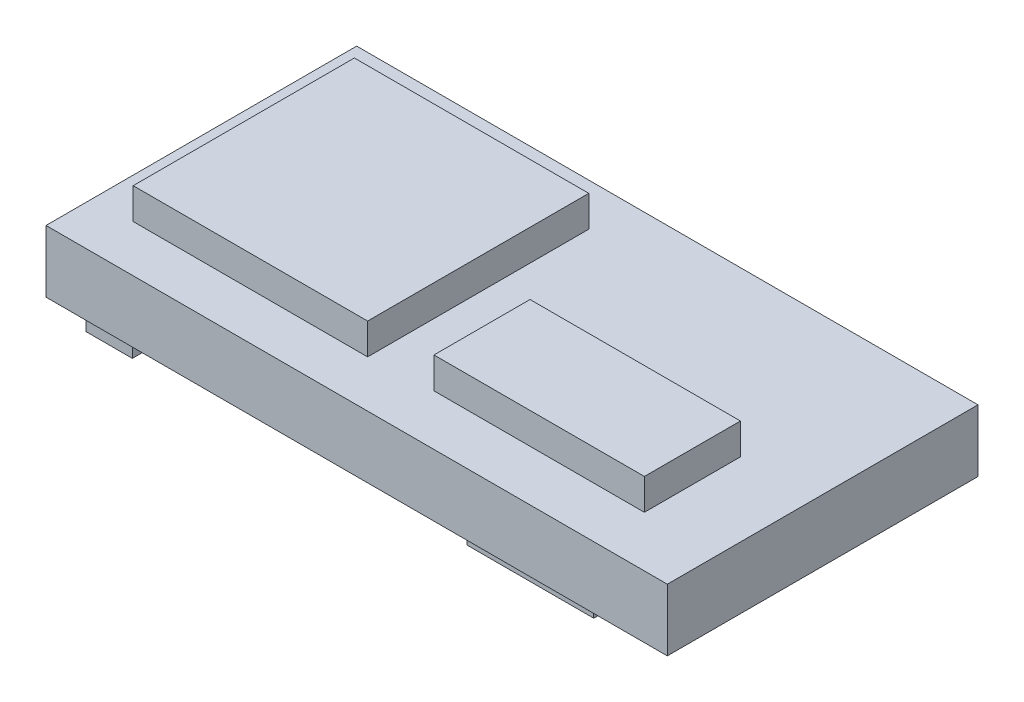
ISO-10303-21;
HEADER;
FILE_DESCRIPTION(('STEP AP214'),'2;1');
FILE_NAME('part.step','',(''),(''),'','','');
FILE_SCHEMA(('AUTOMOTIVE_DESIGN { 1 0 10303 214 1 1 1 1 }'));
ENDSEC;
DATA;
#1=APPLICATION_CONTEXT('core data for automotive mechanical design processes');
#2=APPLICATION_PROTOCOL_DEFINITION('international standard','automotive_design',2000,#1);
#3=PRODUCT_CONTEXT('',#1,'mechanical');
#4=PRODUCT('Part','Part','',(#3));
#5=PRODUCT_RELATED_PRODUCT_CATEGORY('part','',(#4));
#6=PRODUCT_DEFINITION_FORMATION('','',#4);
#7=PRODUCT_DEFINITION_CONTEXT('part definition',#1,'design');
#8=PRODUCT_DEFINITION('design','',#6,#7);
#9=PRODUCT_DEFINITION_SHAPE('','',#8);
#10=(LENGTH_UNIT() NAMED_UNIT(*) SI_UNIT(.MILLI.,.METRE.));
#11=(NAMED_UNIT(*) PLANE_ANGLE_UNIT() SI_UNIT($,.RADIAN.));
#12=(NAMED_UNIT(*) SI_UNIT($,.STERADIAN.) SOLID_ANGLE_UNIT());
#13=UNCERTAINTY_MEASURE_WITH_UNIT(LENGTH_MEASURE(1.E-05),#10,'distance_accuracy_value','');
#14=(GEOMETRIC_REPRESENTATION_CONTEXT(3) GLOBAL_UNCERTAINTY_ASSIGNED_CONTEXT((#13)) GLOBAL_UNIT_ASSIGNED_CONTEXT((#10,
#11,#12)) REPRESENTATION_CONTEXT('',''));
#15=CARTESIAN_POINT('',(0.,0.,0.));
#16=DIRECTION('',(0.,0.,1.));
#17=DIRECTION('',(1.,0.,0.));
#18=AXIS2_PLACEMENT_3D('',#15,#16,#17);
#19=CARTESIAN_POINT('',(0.,0.,0.));
#20=DIRECTION('',(0.,1.,0.));
#21=DIRECTION('',(0.,0.,1.));
#22=AXIS2_PLACEMENT_3D('',#19,#20,#21);
#23=PLANE('',#22);
#24=DIRECTION('',(0.,0.,1.));
#25=VECTOR('',#24,1.);
#26=CARTESIAN_POINT('',(-10.0391604044603,0.,2.86887811132885));
#27=LINE('',#26,#25);
#28=CARTESIAN_POINT('',(-10.0391604044603,0.,2.86887811132885));
#29=VERTEX_POINT('',#28);
#30=CARTESIAN_POINT('',(-10.0391604044603,0.,5.48169122046716));
#31=VERTEX_POINT('',#30);
#32=EDGE_CURVE('E263',#29,#31,#27,.T.);
#33=ORIENTED_EDGE('',*,*,#32,.F.);
#34=DIRECTION('',(1.,0.,0.));
#35=VECTOR('',#34,1.);
#36=CARTESIAN_POINT('',(-10.0391604044603,0.,2.86887811132885));
#37=LINE('',#36,#35);
#38=CARTESIAN_POINT('',(-11.9295872624434,0.,2.86887811132885));
#39=VERTEX_POINT('',#38);
#40=EDGE_CURVE('E276',#39,#29,#37,.T.);
#41=ORIENTED_EDGE('',*,*,#40,.F.);
#42=DIRECTION('',(0.,0.,-1.));
#43=VECTOR('',#42,1.);
#44=CARTESIAN_POINT('',(-11.9295872624434,0.,2.86887811132885));
#45=LINE('',#44,#43);
#46=CARTESIAN_POINT('',(-11.9295872624434,0.,5.48169122046716));
#47=VERTEX_POINT('',#46);
#48=EDGE_CURVE('E285',#47,#39,#45,.T.);
#49=ORIENTED_EDGE('',*,*,#48,.F.);
#50=DIRECTION('',(-1.,0.,0.));
#51=VECTOR('',#50,1.);
#52=CARTESIAN_POINT('',(-10.0391604044603,0.,5.48169122046716));
#53=LINE('',#52,#51);
#54=EDGE_CURVE('E266',#31,#47,#53,.T.);
#55=ORIENTED_EDGE('',*,*,#54,.F.);
#56=EDGE_LOOP('',(#33,#41,#49,#55));
#57=FACE_BOUND('',#56,.T.);
#58=DIRECTION('',(0.,0.,1.));
#59=VECTOR('',#58,1.);
#60=CARTESIAN_POINT('',(-10.0391604044603,0.,-5.21407019473941));
#61=LINE('',#60,#59);
#62=CARTESIAN_POINT('',(-10.0391604044603,0.,-5.21407019473941));
#63=VERTEX_POINT('',#62);
#64=CARTESIAN_POINT('',(-10.0391604044603,0.,-2.2372155645769));
#65=VERTEX_POINT('',#64);
#66=EDGE_CURVE('E334',#63,#65,#61,.T.);
#67=ORIENTED_EDGE('',*,*,#66,.F.);
#68=DIRECTION('',(1.,0.,0.));
#69=VECTOR('',#68,1.);
#70=CARTESIAN_POINT('',(-10.0391604044603,0.,-5.21407019473941));
#71=LINE('',#70,#69);
#72=CARTESIAN_POINT('',(-11.9295872624434,0.,-5.21407019473941));
#73=VERTEX_POINT('',#72);
#74=EDGE_CURVE('E339',#73,#63,#71,.T.);
#75=ORIENTED_EDGE('',*,*,#74,.F.);
#76=DIRECTION('',(0.,0.,-1.));
#77=VECTOR('',#76,1.);
#78=CARTESIAN_POINT('',(-11.9295872624434,0.,-5.21407019473941));
#79=LINE('',#78,#77);
#80=CARTESIAN_POINT('',(-11.9295872624434,0.,-2.2372155645769));
#81=VERTEX_POINT('',#80);
#82=EDGE_CURVE('E351',#81,#73,#79,.T.);
#83=ORIENTED_EDGE('',*,*,#82,.F.);
#84=DIRECTION('',(-1.,0.,0.));
#85=VECTOR('',#84,1.);
#86=CARTESIAN_POINT('',(-10.0391604044603,0.,-2.2372155645769));
#87=LINE('',#86,#85);
#88=EDGE_CURVE('E348',#65,#81,#87,.T.);
#89=ORIENTED_EDGE('',*,*,#88,.F.);
#90=EDGE_LOOP('',(#67,#75,#83,#89));
#91=FACE_BOUND('',#90,.T.);
#92=DIRECTION('',(0.,0.,1.));
#93=VECTOR('',#92,1.);
#94=CARTESIAN_POINT('',(-12.7,0.,6.35));
#95=LINE('',#94,#93);
#96=CARTESIAN_POINT('',(-12.7,0.,-6.35));
#97=VERTEX_POINT('',#96);
#98=CARTESIAN_POINT('',(-12.7,0.,6.35));
#99=VERTEX_POINT('',#98);
#100=EDGE_CURVE('E458',#97,#99,#95,.T.);
#101=ORIENTED_EDGE('',*,*,#100,.F.);
#102=DIRECTION('',(-1.,0.,0.));
#103=VECTOR('',#102,1.);
#104=CARTESIAN_POINT('',(12.7,0.,-6.35));
#105=LINE('',#104,#103);
#106=CARTESIAN_POINT('',(12.7,0.,-6.35));
#107=VERTEX_POINT('',#106);
#108=EDGE_CURVE('E463',#107,#97,#105,.T.);
#109=ORIENTED_EDGE('',*,*,#108,.F.);
#110=DIRECTION('',(0.,0.,-1.));
#111=VECTOR('',#110,1.);
#112=CARTESIAN_POINT('',(12.7,0.,6.35));
#113=LINE('',#112,#111);
#114=CARTESIAN_POINT('',(12.7,0.,6.35));
#115=VERTEX_POINT('',#114);
#116=EDGE_CURVE('E474',#115,#107,#113,.T.);
#117=ORIENTED_EDGE('',*,*,#116,.F.);
#118=DIRECTION('',(1.,0.,0.));
#119=VECTOR('',#118,1.);
#120=CARTESIAN_POINT('',(12.7,0.,6.35));
#121=LINE('',#120,#119);
#122=EDGE_CURVE('E472',#99,#115,#121,.T.);
#123=ORIENTED_EDGE('',*,*,#122,.F.);
#124=EDGE_LOOP('',(#101,#109,#117,#123));
#125=FACE_BOUND('',#124,.T.);
#126=DIRECTION('',(0.,0.,1.));
#127=VECTOR('',#126,1.);
#128=CARTESIAN_POINT('',(1.5898607842928,0.,-2.2372155645769));
#129=LINE('',#128,#127);
#130=CARTESIAN_POINT('',(1.5898607842928,0.,-2.2372155645769));
#131=VERTEX_POINT('',#130);
#132=CARTESIAN_POINT('',(1.5898607842928,0.,3.65678358603816));
#133=VERTEX_POINT('',#132);
#134=EDGE_CURVE('E367',#131,#133,#129,.T.);
#135=ORIENTED_EDGE('',*,*,#134,.F.);
#136=DIRECTION('',(1.,0.,0.));
#137=VECTOR('',#136,1.);
#138=CARTESIAN_POINT('',(1.5898607842928,0.,-2.2372155645769));
#139=LINE('',#138,#137);
#140=CARTESIAN_POINT('',(-3.91703483796846,0.,-2.2372155645769));
#141=VERTEX_POINT('',#140);
#142=EDGE_CURVE('E372',#141,#131,#139,.T.);
#143=ORIENTED_EDGE('',*,*,#142,.F.);
#144=DIRECTION('',(0.,0.,-1.));
#145=VECTOR('',#144,1.);
#146=CARTESIAN_POINT('',(-3.91703483796846,0.,-2.2372155645769));
#147=LINE('',#146,#145);
#148=CARTESIAN_POINT('',(-3.91703483796846,0.,3.65678358603816));
#149=VERTEX_POINT('',#148);
#150=EDGE_CURVE('E384',#149,#141,#147,.T.);
#151=ORIENTED_EDGE('',*,*,#150,.F.);
#152=DIRECTION('',(-1.,0.,0.));
#153=VECTOR('',#152,1.);
#154=CARTESIAN_POINT('',(1.5898607842928,0.,3.65678358603816));
#155=LINE('',#154,#153);
#156=EDGE_CURVE('E381',#133,#149,#155,.T.);
#157=ORIENTED_EDGE('',*,*,#156,.F.);
#158=EDGE_LOOP('',(#135,#143,#151,#157));
#159=FACE_BOUND('',#158,.T.);
#160=DIRECTION('',(0.,0.,1.));
#161=VECTOR('',#160,1.);
#162=CARTESIAN_POINT('',(-10.0391604044603,0.,-1.09416741381096));
#163=LINE('',#162,#161);
#164=CARTESIAN_POINT('',(-10.0391604044603,0.,-1.09416741381096));
#165=VERTEX_POINT('',#164);
#166=CARTESIAN_POINT('',(-10.0391604044603,0.,1.83236020687616));
#167=VERTEX_POINT('',#166);
#168=EDGE_CURVE('E301',#165,#167,#163,.T.);
#169=ORIENTED_EDGE('',*,*,#168,.F.);
#170=DIRECTION('',(1.,0.,0.));
#171=VECTOR('',#170,1.);
#172=CARTESIAN_POINT('',(-10.0391604044603,0.,-1.09416741381096));
#173=LINE('',#172,#171);
#174=CARTESIAN_POINT('',(-11.9295872624434,0.,-1.09416741381096));
#175=VERTEX_POINT('',#174);
#176=EDGE_CURVE('E306',#175,#165,#173,.T.);
#177=ORIENTED_EDGE('',*,*,#176,.F.);
#178=DIRECTION('',(0.,0.,-1.));
#179=VECTOR('',#178,1.);
#180=CARTESIAN_POINT('',(-11.9295872624434,0.,-1.09416741381096));
#181=LINE('',#180,#179);
#182=CARTESIAN_POINT('',(-11.9295872624434,0.,1.83236020687616));
#183=VERTEX_POINT('',#182);
#184=EDGE_CURVE('E318',#183,#175,#181,.T.);
#185=ORIENTED_EDGE('',*,*,#184,.F.);
#186=DIRECTION('',(-1.,0.,0.));
#187=VECTOR('',#186,1.);
#188=CARTESIAN_POINT('',(-10.0391604044603,0.,1.83236020687616));
#189=LINE('',#188,#187);
#190=EDGE_CURVE('E315',#167,#183,#189,.T.);
#191=ORIENTED_EDGE('',*,*,#190,.F.);
#192=EDGE_LOOP('',(#169,#177,#185,#191));
#193=FACE_BOUND('',#192,.T.);
#194=DIRECTION('',(0.,0.,1.));
#195=VECTOR('',#194,1.);
#196=CARTESIAN_POINT('',(8.5913828855837,0.,1.38506022395291));
#197=LINE('',#196,#195);
#198=CARTESIAN_POINT('',(8.5913828855837,0.,1.38506022395291));
#199=VERTEX_POINT('',#198);
#200=CARTESIAN_POINT('',(8.5913828855837,0.,5.25072071499721));
#201=VERTEX_POINT('',#200);
#202=EDGE_CURVE('E262',#199,#201,#197,.T.);
#203=ORIENTED_EDGE('',*,*,#202,.F.);
#204=DIRECTION('',(1.,0.,0.));
#205=VECTOR('',#204,1.);
#206=CARTESIAN_POINT('',(8.5913828855837,0.,1.38506022395291));
#207=LINE('',#206,#205);
#208=CARTESIAN_POINT('',(3.41832114617091,0.,1.38506022395291));
#209=VERTEX_POINT('',#208);
#210=EDGE_CURVE('E259',#209,#199,#207,.T.);
#211=ORIENTED_EDGE('',*,*,#210,.F.);
#212=DIRECTION('',(0.,0.,-1.));
#213=VECTOR('',#212,1.);
#214=CARTESIAN_POINT('',(3.41832114617091,0.,1.38506022395291));
#215=LINE('',#214,#213);
#216=CARTESIAN_POINT('',(3.41832114617091,0.,5.25072071499721));
#217=VERTEX_POINT('',#216);
#218=EDGE_CURVE('E53',#217,#209,#215,.T.);
#219=ORIENTED_EDGE('',*,*,#218,.F.);
#220=DIRECTION('',(-1.,0.,0.));
#221=VECTOR('',#220,1.);
#222=CARTESIAN_POINT('',(8.5913828855837,0.,5.25072071499721));
#223=LINE('',#222,#221);
#224=EDGE_CURVE('E48',#201,#217,#223,.T.);
#225=ORIENTED_EDGE('',*,*,#224,.F.);
#226=EDGE_LOOP('',(#203,#211,#219,#225));
#227=FACE_BOUND('',#226,.T.);
#228=ADVANCED_FACE('F33',(#57,#91,#125,#159,#193,#227),#23,.F.);
#229=CARTESIAN_POINT('',(0.,2.54,0.));
#230=DIRECTION('',(0.,1.,0.));
#231=DIRECTION('',(0.,0.,1.));
#232=AXIS2_PLACEMENT_3D('',#229,#230,#231);
#233=PLANE('',#232);
#234=DIRECTION('',(0.,0.,1.));
#235=VECTOR('',#234,1.);
#236=CARTESIAN_POINT('',(-12.7,2.54,6.35));
#237=LINE('',#236,#235);
#238=CARTESIAN_POINT('',(-12.7,2.54,-6.35));
#239=VERTEX_POINT('',#238);
#240=CARTESIAN_POINT('',(-12.7,2.54,6.35));
#241=VERTEX_POINT('',#240);
#242=EDGE_CURVE('E459',#239,#241,#237,.T.);
#243=ORIENTED_EDGE('',*,*,#242,.T.);
#244=DIRECTION('',(1.,0.,0.));
#245=VECTOR('',#244,1.);
#246=CARTESIAN_POINT('',(12.7,2.54,6.35));
#247=LINE('',#246,#245);
#248=CARTESIAN_POINT('',(12.7,2.54,6.35));
#249=VERTEX_POINT('',#248);
#250=EDGE_CURVE('E462',#241,#249,#247,.T.);
#251=ORIENTED_EDGE('',*,*,#250,.T.);
#252=DIRECTION('',(0.,0.,-1.));
#253=VECTOR('',#252,1.);
#254=CARTESIAN_POINT('',(12.7,2.54,6.35));
#255=LINE('',#254,#253);
#256=CARTESIAN_POINT('',(12.7,2.54,-6.35));
#257=VERTEX_POINT('',#256);
#258=EDGE_CURVE('E465',#249,#257,#255,.T.);
#259=ORIENTED_EDGE('',*,*,#258,.T.);
#260=DIRECTION('',(-1.,0.,0.));
#261=VECTOR('',#260,1.);
#262=CARTESIAN_POINT('',(12.7,2.54,-6.35));
#263=LINE('',#262,#261);
#264=EDGE_CURVE('E467',#257,#239,#263,.T.);
#265=ORIENTED_EDGE('',*,*,#264,.T.);
#266=EDGE_LOOP('',(#243,#251,#259,#265));
#267=FACE_BOUND('',#266,.T.);
#268=DIRECTION('',(1.,0.,0.));
#269=VECTOR('',#268,1.);
#270=CARTESIAN_POINT('',(-11.0562290416038,2.54,4.43024130989497));
#271=LINE('',#270,#269);
#272=CARTESIAN_POINT('',(-11.0562290416038,2.54,4.43024130989497));
#273=VERTEX_POINT('',#272);
#274=CARTESIAN_POINT('',(-1.47244171815752,2.54,4.43024130989497));
#275=VERTEX_POINT('',#274);
#276=EDGE_CURVE('E443',#273,#275,#271,.T.);
#277=ORIENTED_EDGE('',*,*,#276,.F.);
#278=DIRECTION('',(0.,0.,1.));
#279=VECTOR('',#278,1.);
#280=CARTESIAN_POINT('',(-11.0562290416038,2.54,-4.61106748580907));
#281=LINE('',#280,#279);
#282=CARTESIAN_POINT('',(-11.0562290416038,2.54,-4.61106748580907));
#283=VERTEX_POINT('',#282);
#284=EDGE_CURVE('E429',#283,#273,#281,.T.);
#285=ORIENTED_EDGE('',*,*,#284,.F.);
#286=DIRECTION('',(-1.,0.,0.));
#287=VECTOR('',#286,1.);
#288=CARTESIAN_POINT('',(-11.0562290416038,2.54,-4.61106748580907));
#289=LINE('',#288,#287);
#290=CARTESIAN_POINT('',(-1.47244171815752,2.54,-4.61106748580907));
#291=VERTEX_POINT('',#290);
#292=EDGE_CURVE('E434',#291,#283,#289,.T.);
#293=ORIENTED_EDGE('',*,*,#292,.F.);
#294=DIRECTION('',(0.,0.,-1.));
#295=VECTOR('',#294,1.);
#296=CARTESIAN_POINT('',(-1.47244171815752,2.54,-4.61106748580907));
#297=LINE('',#296,#295);
#298=EDGE_CURVE('E445',#275,#291,#297,.T.);
#299=ORIENTED_EDGE('',*,*,#298,.F.);
#300=EDGE_LOOP('',(#277,#285,#293,#299));
#301=FACE_BOUND('',#300,.T.);
#302=DIRECTION('',(1.,0.,0.));
#303=VECTOR('',#302,1.);
#304=CARTESIAN_POINT('',(1.08495705548449,2.54,4.27524744482576));
#305=LINE('',#304,#303);
#306=CARTESIAN_POINT('',(1.08495705548449,2.54,4.27524744482576));
#307=VERTEX_POINT('',#306);
#308=CARTESIAN_POINT('',(9.68711656682577,2.54,4.27524744482576));
#309=VERTEX_POINT('',#308);
#310=EDGE_CURVE('E414',#307,#309,#305,.T.);
#311=ORIENTED_EDGE('',*,*,#310,.F.);
#312=DIRECTION('',(0.,0.,1.));
#313=VECTOR('',#312,1.);
#314=CARTESIAN_POINT('',(1.08495705548449,2.54,0.348736196405719));
#315=LINE('',#314,#313);
#316=CARTESIAN_POINT('',(1.08495705548449,2.54,0.348736196405719));
#317=VERTEX_POINT('',#316);
#318=EDGE_CURVE('E400',#317,#307,#315,.T.);
#319=ORIENTED_EDGE('',*,*,#318,.F.);
#320=DIRECTION('',(-1.,0.,0.));
#321=VECTOR('',#320,1.);
#322=CARTESIAN_POINT('',(1.08495705548449,2.54,0.348736196405719));
#323=LINE('',#322,#321);
#324=CARTESIAN_POINT('',(9.68711656682577,2.54,0.348736196405719));
#325=VERTEX_POINT('',#324);
#326=EDGE_CURVE('E405',#325,#317,#323,.T.);
#327=ORIENTED_EDGE('',*,*,#326,.F.);
#328=DIRECTION('',(0.,0.,-1.));
#329=VECTOR('',#328,1.);
#330=CARTESIAN_POINT('',(9.68711656682577,2.54,0.348736196405719));
#331=LINE('',#330,#329);
#332=EDGE_CURVE('E416',#309,#325,#331,.T.);
#333=ORIENTED_EDGE('',*,*,#332,.F.);
#334=EDGE_LOOP('',(#311,#319,#327,#333));
#335=FACE_BOUND('',#334,.T.);
#336=ADVANCED_FACE('F501',(#267,#301,#335),#233,.T.);
#337=CARTESIAN_POINT('',(-12.7,2.54,6.35));
#338=DIRECTION('',(1.,0.,0.));
#339=DIRECTION('',(0.,0.,-1.));
#340=AXIS2_PLACEMENT_3D('',#337,#338,#339);
#341=PLANE('',#340);
#342=ORIENTED_EDGE('',*,*,#100,.T.);
#343=DIRECTION('',(0.,-1.,0.));
#344=VECTOR('',#343,1.);
#345=CARTESIAN_POINT('',(-12.7,2.54,6.35));
#346=LINE('',#345,#344);
#347=EDGE_CURVE('E11',#241,#99,#346,.T.);
#348=ORIENTED_EDGE('',*,*,#347,.F.);
#349=ORIENTED_EDGE('',*,*,#242,.F.);
#350=DIRECTION('',(0.,-1.,0.));
#351=VECTOR('',#350,1.);
#352=CARTESIAN_POINT('',(-12.7,2.54,-6.35));
#353=LINE('',#352,#351);
#354=EDGE_CURVE('E469',#239,#97,#353,.T.);
#355=ORIENTED_EDGE('',*,*,#354,.T.);
#356=EDGE_LOOP('',(#342,#348,#349,#355));
#357=FACE_BOUND('',#356,.T.);
#358=ADVANCED_FACE('F35',(#357),#341,.F.);
#359=CARTESIAN_POINT('',(12.7,2.54,6.35));
#360=DIRECTION('',(0.,0.,-1.));
#361=DIRECTION('',(-1.,0.,0.));
#362=AXIS2_PLACEMENT_3D('',#359,#360,#361);
#363=PLANE('',#362);
#364=ORIENTED_EDGE('',*,*,#122,.T.);
#365=DIRECTION('',(0.,-1.,0.));
#366=VECTOR('',#365,1.);
#367=CARTESIAN_POINT('',(12.7,2.54,6.35));
#368=LINE('',#367,#366);
#369=EDGE_CURVE('E41',#249,#115,#368,.T.);
#370=ORIENTED_EDGE('',*,*,#369,.F.);
#371=ORIENTED_EDGE('',*,*,#250,.F.);
#372=ORIENTED_EDGE('',*,*,#347,.T.);
#373=EDGE_LOOP('',(#364,#370,#371,#372));
#374=FACE_BOUND('',#373,.T.);
#375=ADVANCED_FACE('F503',(#374),#363,.F.);
#376=CARTESIAN_POINT('',(12.7,2.54,6.35));
#377=DIRECTION('',(-1.,0.,0.));
#378=DIRECTION('',(0.,0.,1.));
#379=AXIS2_PLACEMENT_3D('',#376,#377,#378);
#380=PLANE('',#379);
#381=ORIENTED_EDGE('',*,*,#116,.T.);
#382=DIRECTION('',(0.,-1.,0.));
#383=VECTOR('',#382,1.);
#384=CARTESIAN_POINT('',(12.7,2.54,-6.35));
#385=LINE('',#384,#383);
#386=EDGE_CURVE('E479',#257,#107,#385,.T.);
#387=ORIENTED_EDGE('',*,*,#386,.F.);
#388=ORIENTED_EDGE('',*,*,#258,.F.);
#389=ORIENTED_EDGE('',*,*,#369,.T.);
#390=EDGE_LOOP('',(#381,#387,#388,#389));
#391=FACE_BOUND('',#390,.T.);
#392=ADVANCED_FACE('F486',(#391),#380,.F.);
#393=CARTESIAN_POINT('',(12.7,2.54,-6.35));
#394=DIRECTION('',(0.,0.,1.));
#395=DIRECTION('',(1.,0.,0.));
#396=AXIS2_PLACEMENT_3D('',#393,#394,#395);
#397=PLANE('',#396);
#398=ORIENTED_EDGE('',*,*,#108,.T.);
#399=ORIENTED_EDGE('',*,*,#354,.F.);
#400=ORIENTED_EDGE('',*,*,#264,.F.);
#401=ORIENTED_EDGE('',*,*,#386,.T.);
#402=EDGE_LOOP('',(#398,#399,#400,#401));
#403=FACE_BOUND('',#402,.T.);
#404=ADVANCED_FACE('F495',(#403),#397,.F.);
#405=CARTESIAN_POINT('',(-11.0562290416038,3.81,-4.61106748580907));
#406=DIRECTION('',(1.,0.,0.));
#407=DIRECTION('',(0.,0.,-1.));
#408=AXIS2_PLACEMENT_3D('',#405,#406,#407);
#409=PLANE('',#408);
#410=ORIENTED_EDGE('',*,*,#284,.T.);
#411=DIRECTION('',(0.,-1.,0.));
#412=VECTOR('',#411,1.);
#413=CARTESIAN_POINT('',(-11.0562290416038,3.81,4.43024130989497));
#414=LINE('',#413,#412);
#415=CARTESIAN_POINT('',(-11.0562290416038,3.81,4.43024130989497));
#416=VERTEX_POINT('',#415);
#417=EDGE_CURVE('E456',#416,#273,#414,.T.);
#418=ORIENTED_EDGE('',*,*,#417,.F.);
#419=DIRECTION('',(0.,0.,1.));
#420=VECTOR('',#419,1.);
#421=CARTESIAN_POINT('',(-11.0562290416038,3.81,-4.61106748580907));
#422=LINE('',#421,#420);
#423=CARTESIAN_POINT('',(-11.0562290416038,3.81,-4.61106748580907));
#424=VERTEX_POINT('',#423);
#425=EDGE_CURVE('E430',#424,#416,#422,.T.);
#426=ORIENTED_EDGE('',*,*,#425,.F.);
#427=DIRECTION('',(0.,-1.,0.));
#428=VECTOR('',#427,1.);
#429=CARTESIAN_POINT('',(-11.0562290416038,3.81,-4.61106748580907));
#430=LINE('',#429,#428);
#431=EDGE_CURVE('E440',#424,#283,#430,.T.);
#432=ORIENTED_EDGE('',*,*,#431,.T.);
#433=EDGE_LOOP('',(#410,#418,#426,#432));
#434=FACE_BOUND('',#433,.T.);
#435=ADVANCED_FACE('F521',(#434),#409,.F.);
#436=CARTESIAN_POINT('',(-11.0562290416038,3.81,4.43024130989497));
#437=DIRECTION('',(0.,0.,-1.));
#438=DIRECTION('',(-1.,0.,0.));
#439=AXIS2_PLACEMENT_3D('',#436,#437,#438);
#440=PLANE('',#439);
#441=ORIENTED_EDGE('',*,*,#276,.T.);
#442=DIRECTION('',(0.,-1.,0.));
#443=VECTOR('',#442,1.);
#444=CARTESIAN_POINT('',(-1.47244171815752,3.81,4.43024130989497));
#445=LINE('',#444,#443);
#446=CARTESIAN_POINT('',(-1.47244171815752,3.81,4.43024130989497));
#447=VERTEX_POINT('',#446);
#448=EDGE_CURVE('E453',#447,#275,#445,.T.);
#449=ORIENTED_EDGE('',*,*,#448,.F.);
#450=DIRECTION('',(1.,0.,0.));
#451=VECTOR('',#450,1.);
#452=CARTESIAN_POINT('',(-11.0562290416038,3.81,4.43024130989497));
#453=LINE('',#452,#451);
#454=EDGE_CURVE('E433',#416,#447,#453,.T.);
#455=ORIENTED_EDGE('',*,*,#454,.F.);
#456=ORIENTED_EDGE('',*,*,#417,.T.);
#457=EDGE_LOOP('',(#441,#449,#455,#456));
#458=FACE_BOUND('',#457,.T.);
#459=ADVANCED_FACE('F525',(#458),#440,.F.);
#460=CARTESIAN_POINT('',(-1.47244171815752,3.81,-4.61106748580907));
#461=DIRECTION('',(-1.,0.,0.));
#462=DIRECTION('',(0.,0.,1.));
#463=AXIS2_PLACEMENT_3D('',#460,#461,#462);
#464=PLANE('',#463);
#465=ORIENTED_EDGE('',*,*,#298,.T.);
#466=DIRECTION('',(0.,-1.,0.));
#467=VECTOR('',#466,1.);
#468=CARTESIAN_POINT('',(-1.47244171815752,3.81,-4.61106748580907));
#469=LINE('',#468,#467);
#470=CARTESIAN_POINT('',(-1.47244171815752,3.81,-4.61106748580907));
#471=VERTEX_POINT('',#470);
#472=EDGE_CURVE('E451',#471,#291,#469,.T.);
#473=ORIENTED_EDGE('',*,*,#472,.F.);
#474=DIRECTION('',(0.,0.,-1.));
#475=VECTOR('',#474,1.);
#476=CARTESIAN_POINT('',(-1.47244171815752,3.81,-4.61106748580907));
#477=LINE('',#476,#475);
#478=EDGE_CURVE('E436',#447,#471,#477,.T.);
#479=ORIENTED_EDGE('',*,*,#478,.F.);
#480=ORIENTED_EDGE('',*,*,#448,.T.);
#481=EDGE_LOOP('',(#465,#473,#479,#480));
#482=FACE_BOUND('',#481,.T.);
#483=ADVANCED_FACE('F530',(#482),#464,.F.);
#484=CARTESIAN_POINT('',(-11.0562290416038,3.81,-4.61106748580907));
#485=DIRECTION('',(0.,0.,1.));
#486=DIRECTION('',(1.,0.,0.));
#487=AXIS2_PLACEMENT_3D('',#484,#485,#486);
#488=PLANE('',#487);
#489=ORIENTED_EDGE('',*,*,#292,.T.);
#490=ORIENTED_EDGE('',*,*,#431,.F.);
#491=DIRECTION('',(-1.,0.,0.));
#492=VECTOR('',#491,1.);
#493=CARTESIAN_POINT('',(-11.0562290416038,3.81,-4.61106748580907));
#494=LINE('',#493,#492);
#495=EDGE_CURVE('E438',#471,#424,#494,.T.);
#496=ORIENTED_EDGE('',*,*,#495,.F.);
#497=ORIENTED_EDGE('',*,*,#472,.T.);
#498=EDGE_LOOP('',(#489,#490,#496,#497));
#499=FACE_BOUND('',#498,.T.);
#500=ADVANCED_FACE('F536',(#499),#488,.F.);
#501=CARTESIAN_POINT('',(0.,3.81,0.));
#502=DIRECTION('',(0.,1.,0.));
#503=DIRECTION('',(0.,0.,1.));
#504=AXIS2_PLACEMENT_3D('',#501,#502,#503);
#505=PLANE('',#504);
#506=ORIENTED_EDGE('',*,*,#425,.T.);
#507=ORIENTED_EDGE('',*,*,#454,.T.);
#508=ORIENTED_EDGE('',*,*,#478,.T.);
#509=ORIENTED_EDGE('',*,*,#495,.T.);
#510=EDGE_LOOP('',(#506,#507,#508,#509));
#511=FACE_BOUND('',#510,.T.);
#512=ADVANCED_FACE('F540',(#511),#505,.T.);
#513=CARTESIAN_POINT('',(1.08495705548449,3.81,0.348736196405719));
#514=DIRECTION('',(1.,0.,0.));
#515=DIRECTION('',(0.,0.,-1.));
#516=AXIS2_PLACEMENT_3D('',#513,#514,#515);
#517=PLANE('',#516);
#518=ORIENTED_EDGE('',*,*,#318,.T.);
#519=DIRECTION('',(0.,-1.,0.));
#520=VECTOR('',#519,1.);
#521=CARTESIAN_POINT('',(1.08495705548449,3.81,4.27524744482576));
#522=LINE('',#521,#520);
#523=CARTESIAN_POINT('',(1.08495705548449,3.81,4.27524744482576));
#524=VERTEX_POINT('',#523);
#525=EDGE_CURVE('E427',#524,#307,#522,.T.);
#526=ORIENTED_EDGE('',*,*,#525,.F.);
#527=DIRECTION('',(0.,0.,1.));
#528=VECTOR('',#527,1.);
#529=CARTESIAN_POINT('',(1.08495705548449,3.81,0.348736196405719));
#530=LINE('',#529,#528);
#531=CARTESIAN_POINT('',(1.08495705548449,3.81,0.348736196405719));
#532=VERTEX_POINT('',#531);
#533=EDGE_CURVE('E401',#532,#524,#530,.T.);
#534=ORIENTED_EDGE('',*,*,#533,.F.);
#535=DIRECTION('',(0.,-1.,0.));
#536=VECTOR('',#535,1.);
#537=CARTESIAN_POINT('',(1.08495705548449,3.81,0.348736196405719));
#538=LINE('',#537,#536);
#539=EDGE_CURVE('E411',#532,#317,#538,.T.);
#540=ORIENTED_EDGE('',*,*,#539,.T.);
#541=EDGE_LOOP('',(#518,#526,#534,#540));
#542=FACE_BOUND('',#541,.T.);
#543=ADVANCED_FACE('F544',(#542),#517,.F.);
#544=CARTESIAN_POINT('',(1.08495705548449,3.81,4.27524744482576));
#545=DIRECTION('',(0.,0.,-1.));
#546=DIRECTION('',(-1.,0.,0.));
#547=AXIS2_PLACEMENT_3D('',#544,#545,#546);
#548=PLANE('',#547);
#549=ORIENTED_EDGE('',*,*,#310,.T.);
#550=DIRECTION('',(0.,-1.,0.));
#551=VECTOR('',#550,1.);
#552=CARTESIAN_POINT('',(9.68711656682577,3.81,4.27524744482576));
#553=LINE('',#552,#551);
#554=CARTESIAN_POINT('',(9.68711656682577,3.81,4.27524744482576));
#555=VERTEX_POINT('',#554);
#556=EDGE_CURVE('E424',#555,#309,#553,.T.);
#557=ORIENTED_EDGE('',*,*,#556,.F.);
#558=DIRECTION('',(1.,0.,0.));
#559=VECTOR('',#558,1.);
#560=CARTESIAN_POINT('',(1.08495705548449,3.81,4.27524744482576));
#561=LINE('',#560,#559);
#562=EDGE_CURVE('E404',#524,#555,#561,.T.);
#563=ORIENTED_EDGE('',*,*,#562,.F.);
#564=ORIENTED_EDGE('',*,*,#525,.T.);
#565=EDGE_LOOP('',(#549,#557,#563,#564));
#566=FACE_BOUND('',#565,.T.);
#567=ADVANCED_FACE('F548',(#566),#548,.F.);
#568=CARTESIAN_POINT('',(9.68711656682577,3.81,0.348736196405719));
#569=DIRECTION('',(-1.,0.,0.));
#570=DIRECTION('',(0.,0.,1.));
#571=AXIS2_PLACEMENT_3D('',#568,#569,#570);
#572=PLANE('',#571);
#573=ORIENTED_EDGE('',*,*,#332,.T.);
#574=DIRECTION('',(0.,-1.,0.));
#575=VECTOR('',#574,1.);
#576=CARTESIAN_POINT('',(9.68711656682577,3.81,0.348736196405719));
#577=LINE('',#576,#575);
#578=CARTESIAN_POINT('',(9.68711656682577,3.81,0.348736196405719));
#579=VERTEX_POINT('',#578);
#580=EDGE_CURVE('E422',#579,#325,#577,.T.);
#581=ORIENTED_EDGE('',*,*,#580,.F.);
#582=DIRECTION('',(0.,0.,-1.));
#583=VECTOR('',#582,1.);
#584=CARTESIAN_POINT('',(9.68711656682577,3.81,0.348736196405719));
#585=LINE('',#584,#583);
#586=EDGE_CURVE('E407',#555,#579,#585,.T.);
#587=ORIENTED_EDGE('',*,*,#586,.F.);
#588=ORIENTED_EDGE('',*,*,#556,.T.);
#589=EDGE_LOOP('',(#573,#581,#587,#588));
#590=FACE_BOUND('',#589,.T.);
#591=ADVANCED_FACE('F552',(#590),#572,.F.);
#592=CARTESIAN_POINT('',(1.08495705548449,3.81,0.348736196405719));
#593=DIRECTION('',(0.,0.,1.));
#594=DIRECTION('',(1.,0.,0.));
#595=AXIS2_PLACEMENT_3D('',#592,#593,#594);
#596=PLANE('',#595);
#597=ORIENTED_EDGE('',*,*,#326,.T.);
#598=ORIENTED_EDGE('',*,*,#539,.F.);
#599=DIRECTION('',(-1.,0.,0.));
#600=VECTOR('',#599,1.);
#601=CARTESIAN_POINT('',(1.08495705548449,3.81,0.348736196405719));
#602=LINE('',#601,#600);
#603=EDGE_CURVE('E409',#579,#532,#602,.T.);
#604=ORIENTED_EDGE('',*,*,#603,.F.);
#605=ORIENTED_EDGE('',*,*,#580,.T.);
#606=EDGE_LOOP('',(#597,#598,#604,#605));
#607=FACE_BOUND('',#606,.T.);
#608=ADVANCED_FACE('F556',(#607),#596,.F.);
#609=CARTESIAN_POINT('',(0.,3.81,0.));
#610=DIRECTION('',(0.,1.,0.));
#611=DIRECTION('',(0.,0.,1.));
#612=AXIS2_PLACEMENT_3D('',#609,#610,#611);
#613=PLANE('',#612);
#614=ORIENTED_EDGE('',*,*,#533,.T.);
#615=ORIENTED_EDGE('',*,*,#562,.T.);
#616=ORIENTED_EDGE('',*,*,#586,.T.);
#617=ORIENTED_EDGE('',*,*,#603,.T.);
#618=EDGE_LOOP('',(#614,#615,#616,#617));
#619=FACE_BOUND('',#618,.T.);
#620=ADVANCED_FACE('F560',(#619),#613,.T.);
#621=CARTESIAN_POINT('',(1.5898607842928,-1.27,-2.2372155645769));
#622=DIRECTION('',(-1.,0.,0.));
#623=DIRECTION('',(0.,0.,1.));
#624=AXIS2_PLACEMENT_3D('',#621,#622,#623);
#625=PLANE('',#624);
#626=ORIENTED_EDGE('',*,*,#134,.T.);
#627=DIRECTION('',(0.,1.,0.));
#628=VECTOR('',#627,1.);
#629=CARTESIAN_POINT('',(1.5898607842928,-1.27,3.65678358603816));
#630=LINE('',#629,#628);
#631=CARTESIAN_POINT('',(1.5898607842928,-1.27,3.65678358603816));
#632=VERTEX_POINT('',#631);
#633=EDGE_CURVE('E397',#632,#133,#630,.T.);
#634=ORIENTED_EDGE('',*,*,#633,.F.);
#635=DIRECTION('',(0.,0.,1.));
#636=VECTOR('',#635,1.);
#637=CARTESIAN_POINT('',(1.5898607842928,-1.27,-2.2372155645769));
#638=LINE('',#637,#636);
#639=CARTESIAN_POINT('',(1.5898607842928,-1.27,-2.2372155645769));
#640=VERTEX_POINT('',#639);
#641=EDGE_CURVE('E368',#640,#632,#638,.T.);
#642=ORIENTED_EDGE('',*,*,#641,.F.);
#643=DIRECTION('',(0.,1.,0.));
#644=VECTOR('',#643,1.);
#645=CARTESIAN_POINT('',(1.5898607842928,-1.27,-2.2372155645769));
#646=LINE('',#645,#644);
#647=EDGE_CURVE('E378',#640,#131,#646,.T.);
#648=ORIENTED_EDGE('',*,*,#647,.T.);
#649=EDGE_LOOP('',(#626,#634,#642,#648));
#650=FACE_BOUND('',#649,.T.);
#651=ADVANCED_FACE('F564',(#650),#625,.F.);
#652=CARTESIAN_POINT('',(1.5898607842928,-1.27,3.65678358603816));
#653=DIRECTION('',(0.,0.,-1.));
#654=DIRECTION('',(-1.,0.,0.));
#655=AXIS2_PLACEMENT_3D('',#652,#653,#654);
#656=PLANE('',#655);
#657=ORIENTED_EDGE('',*,*,#156,.T.);
#658=DIRECTION('',(0.,1.,0.));
#659=VECTOR('',#658,1.);
#660=CARTESIAN_POINT('',(-3.91703483796846,-1.27,3.65678358603816));
#661=LINE('',#660,#659);
#662=CARTESIAN_POINT('',(-3.91703483796846,-1.27,3.65678358603816));
#663=VERTEX_POINT('',#662);
#664=EDGE_CURVE('E394',#663,#149,#661,.T.);
#665=ORIENTED_EDGE('',*,*,#664,.F.);
#666=DIRECTION('',(-1.,0.,0.));
#667=VECTOR('',#666,1.);
#668=CARTESIAN_POINT('',(1.5898607842928,-1.27,3.65678358603816));
#669=LINE('',#668,#667);
#670=EDGE_CURVE('E371',#632,#663,#669,.T.);
#671=ORIENTED_EDGE('',*,*,#670,.F.);
#672=ORIENTED_EDGE('',*,*,#633,.T.);
#673=EDGE_LOOP('',(#657,#665,#671,#672));
#674=FACE_BOUND('',#673,.T.);
#675=ADVANCED_FACE('F568',(#674),#656,.F.);
#676=CARTESIAN_POINT('',(-3.91703483796846,-1.27,-2.2372155645769));
#677=DIRECTION('',(1.,0.,0.));
#678=DIRECTION('',(0.,0.,-1.));
#679=AXIS2_PLACEMENT_3D('',#676,#677,#678);
#680=PLANE('',#679);
#681=ORIENTED_EDGE('',*,*,#150,.T.);
#682=DIRECTION('',(0.,1.,0.));
#683=VECTOR('',#682,1.);
#684=CARTESIAN_POINT('',(-3.91703483796846,-1.27,-2.2372155645769));
#685=LINE('',#684,#683);
#686=CARTESIAN_POINT('',(-3.91703483796846,-1.27,-2.2372155645769));
#687=VERTEX_POINT('',#686);
#688=EDGE_CURVE('E391',#687,#141,#685,.T.);
#689=ORIENTED_EDGE('',*,*,#688,.F.);
#690=DIRECTION('',(0.,0.,-1.));
#691=VECTOR('',#690,1.);
#692=CARTESIAN_POINT('',(-3.91703483796846,-1.27,-2.2372155645769));
#693=LINE('',#692,#691);
#694=EDGE_CURVE('E374',#663,#687,#693,.T.);
#695=ORIENTED_EDGE('',*,*,#694,.F.);
#696=ORIENTED_EDGE('',*,*,#664,.T.);
#697=EDGE_LOOP('',(#681,#689,#695,#696));
#698=FACE_BOUND('',#697,.T.);
#699=ADVANCED_FACE('F572',(#698),#680,.F.);
#700=CARTESIAN_POINT('',(1.5898607842928,-1.27,-2.2372155645769));
#701=DIRECTION('',(0.,0.,1.));
#702=DIRECTION('',(1.,0.,0.));
#703=AXIS2_PLACEMENT_3D('',#700,#701,#702);
#704=PLANE('',#703);
#705=ORIENTED_EDGE('',*,*,#142,.T.);
#706=ORIENTED_EDGE('',*,*,#647,.F.);
#707=DIRECTION('',(1.,0.,0.));
#708=VECTOR('',#707,1.);
#709=CARTESIAN_POINT('',(1.5898607842928,-1.27,-2.2372155645769));
#710=LINE('',#709,#708);
#711=EDGE_CURVE('E376',#687,#640,#710,.T.);
#712=ORIENTED_EDGE('',*,*,#711,.F.);
#713=ORIENTED_EDGE('',*,*,#688,.T.);
#714=EDGE_LOOP('',(#705,#706,#712,#713));
#715=FACE_BOUND('',#714,.T.);
#716=ADVANCED_FACE('F576',(#715),#704,.F.);
#717=CARTESIAN_POINT('',(0.,-1.27,0.));
#718=DIRECTION('',(0.,-1.,0.));
#719=DIRECTION('',(0.,0.,-1.));
#720=AXIS2_PLACEMENT_3D('',#717,#718,#719);
#721=PLANE('',#720);
#722=ORIENTED_EDGE('',*,*,#641,.T.);
#723=ORIENTED_EDGE('',*,*,#670,.T.);
#724=ORIENTED_EDGE('',*,*,#694,.T.);
#725=ORIENTED_EDGE('',*,*,#711,.T.);
#726=EDGE_LOOP('',(#722,#723,#724,#725));
#727=FACE_BOUND('',#726,.T.);
#728=ADVANCED_FACE('F580',(#727),#721,.T.);
#729=CARTESIAN_POINT('',(-10.0391604044603,-1.27,-5.21407019473941));
#730=DIRECTION('',(-1.,0.,0.));
#731=DIRECTION('',(0.,0.,1.));
#732=AXIS2_PLACEMENT_3D('',#729,#730,#731);
#733=PLANE('',#732);
#734=ORIENTED_EDGE('',*,*,#66,.T.);
#735=DIRECTION('',(0.,1.,0.));
#736=VECTOR('',#735,1.);
#737=CARTESIAN_POINT('',(-10.0391604044603,-1.27,-2.2372155645769));
#738=LINE('',#737,#736);
#739=CARTESIAN_POINT('',(-10.0391604044603,-1.27,-2.2372155645769));
#740=VERTEX_POINT('',#739);
#741=EDGE_CURVE('E364',#740,#65,#738,.T.);
#742=ORIENTED_EDGE('',*,*,#741,.F.);
#743=DIRECTION('',(0.,0.,1.));
#744=VECTOR('',#743,1.);
#745=CARTESIAN_POINT('',(-10.0391604044603,-1.27,-5.21407019473941));
#746=LINE('',#745,#744);
#747=CARTESIAN_POINT('',(-10.0391604044603,-1.27,-5.21407019473941));
#748=VERTEX_POINT('',#747);
#749=EDGE_CURVE('E335',#748,#740,#746,.T.);
#750=ORIENTED_EDGE('',*,*,#749,.F.);
#751=DIRECTION('',(0.,1.,0.));
#752=VECTOR('',#751,1.);
#753=CARTESIAN_POINT('',(-10.0391604044603,-1.27,-5.21407019473941));
#754=LINE('',#753,#752);
#755=EDGE_CURVE('E345',#748,#63,#754,.T.);
#756=ORIENTED_EDGE('',*,*,#755,.T.);
#757=EDGE_LOOP('',(#734,#742,#750,#756));
#758=FACE_BOUND('',#757,.T.);
#759=ADVANCED_FACE('F584',(#758),#733,.F.);
#760=CARTESIAN_POINT('',(-10.0391604044603,-1.27,-2.2372155645769));
#761=DIRECTION('',(0.,0.,-1.));
#762=DIRECTION('',(-1.,0.,0.));
#763=AXIS2_PLACEMENT_3D('',#760,#761,#762);
#764=PLANE('',#763);
#765=ORIENTED_EDGE('',*,*,#88,.T.);
#766=DIRECTION('',(0.,1.,0.));
#767=VECTOR('',#766,1.);
#768=CARTESIAN_POINT('',(-11.9295872624434,-1.27,-2.2372155645769));
#769=LINE('',#768,#767);
#770=CARTESIAN_POINT('',(-11.9295872624434,-1.27,-2.2372155645769));
#771=VERTEX_POINT('',#770);
#772=EDGE_CURVE('E361',#771,#81,#769,.T.);
#773=ORIENTED_EDGE('',*,*,#772,.F.);
#774=DIRECTION('',(-1.,0.,0.));
#775=VECTOR('',#774,1.);
#776=CARTESIAN_POINT('',(-10.0391604044603,-1.27,-2.2372155645769));
#777=LINE('',#776,#775);
#778=EDGE_CURVE('E338',#740,#771,#777,.T.);
#779=ORIENTED_EDGE('',*,*,#778,.F.);
#780=ORIENTED_EDGE('',*,*,#741,.T.);
#781=EDGE_LOOP('',(#765,#773,#779,#780));
#782=FACE_BOUND('',#781,.T.);
#783=ADVANCED_FACE('F588',(#782),#764,.F.);
#784=CARTESIAN_POINT('',(-11.9295872624434,-1.27,-5.21407019473941));
#785=DIRECTION('',(1.,0.,0.));
#786=DIRECTION('',(0.,0.,-1.));
#787=AXIS2_PLACEMENT_3D('',#784,#785,#786);
#788=PLANE('',#787);
#789=ORIENTED_EDGE('',*,*,#82,.T.);
#790=DIRECTION('',(0.,1.,0.));
#791=VECTOR('',#790,1.);
#792=CARTESIAN_POINT('',(-11.9295872624434,-1.27,-5.21407019473941));
#793=LINE('',#792,#791);
#794=CARTESIAN_POINT('',(-11.9295872624434,-1.27,-5.21407019473941));
#795=VERTEX_POINT('',#794);
#796=EDGE_CURVE('E358',#795,#73,#793,.T.);
#797=ORIENTED_EDGE('',*,*,#796,.F.);
#798=DIRECTION('',(0.,0.,-1.));
#799=VECTOR('',#798,1.);
#800=CARTESIAN_POINT('',(-11.9295872624434,-1.27,-5.21407019473941));
#801=LINE('',#800,#799);
#802=EDGE_CURVE('E341',#771,#795,#801,.T.);
#803=ORIENTED_EDGE('',*,*,#802,.F.);
#804=ORIENTED_EDGE('',*,*,#772,.T.);
#805=EDGE_LOOP('',(#789,#797,#803,#804));
#806=FACE_BOUND('',#805,.T.);
#807=ADVANCED_FACE('F592',(#806),#788,.F.);
#808=CARTESIAN_POINT('',(-10.0391604044603,-1.27,-5.21407019473941));
#809=DIRECTION('',(0.,0.,1.));
#810=DIRECTION('',(1.,0.,0.));
#811=AXIS2_PLACEMENT_3D('',#808,#809,#810);
#812=PLANE('',#811);
#813=ORIENTED_EDGE('',*,*,#74,.T.);
#814=ORIENTED_EDGE('',*,*,#755,.F.);
#815=DIRECTION('',(1.,0.,0.));
#816=VECTOR('',#815,1.);
#817=CARTESIAN_POINT('',(-10.0391604044603,-1.27,-5.21407019473941));
#818=LINE('',#817,#816);
#819=EDGE_CURVE('E343',#795,#748,#818,.T.);
#820=ORIENTED_EDGE('',*,*,#819,.F.);
#821=ORIENTED_EDGE('',*,*,#796,.T.);
#822=EDGE_LOOP('',(#813,#814,#820,#821));
#823=FACE_BOUND('',#822,.T.);
#824=ADVANCED_FACE('F596',(#823),#812,.F.);
#825=CARTESIAN_POINT('',(0.,-1.27,0.));
#826=DIRECTION('',(0.,-1.,0.));
#827=DIRECTION('',(0.,0.,-1.));
#828=AXIS2_PLACEMENT_3D('',#825,#826,#827);
#829=PLANE('',#828);
#830=ORIENTED_EDGE('',*,*,#749,.T.);
#831=ORIENTED_EDGE('',*,*,#778,.T.);
#832=ORIENTED_EDGE('',*,*,#802,.T.);
#833=ORIENTED_EDGE('',*,*,#819,.T.);
#834=EDGE_LOOP('',(#830,#831,#832,#833));
#835=FACE_BOUND('',#834,.T.);
#836=ADVANCED_FACE('F600',(#835),#829,.T.);
#837=CARTESIAN_POINT('',(-10.0391604044603,-1.27,-1.09416741381096));
#838=DIRECTION('',(-1.,0.,0.));
#839=DIRECTION('',(0.,0.,1.));
#840=AXIS2_PLACEMENT_3D('',#837,#838,#839);
#841=PLANE('',#840);
#842=ORIENTED_EDGE('',*,*,#168,.T.);
#843=DIRECTION('',(0.,1.,0.));
#844=VECTOR('',#843,1.);
#845=CARTESIAN_POINT('',(-10.0391604044603,-1.27,1.83236020687616));
#846=LINE('',#845,#844);
#847=CARTESIAN_POINT('',(-10.0391604044603,-1.27,1.83236020687616));
#848=VERTEX_POINT('',#847);
#849=EDGE_CURVE('E331',#848,#167,#846,.T.);
#850=ORIENTED_EDGE('',*,*,#849,.F.);
#851=DIRECTION('',(0.,0.,1.));
#852=VECTOR('',#851,1.);
#853=CARTESIAN_POINT('',(-10.0391604044603,-1.27,-1.09416741381096));
#854=LINE('',#853,#852);
#855=CARTESIAN_POINT('',(-10.0391604044603,-1.27,-1.09416741381096));
#856=VERTEX_POINT('',#855);
#857=EDGE_CURVE('E302',#856,#848,#854,.T.);
#858=ORIENTED_EDGE('',*,*,#857,.F.);
#859=DIRECTION('',(0.,1.,0.));
#860=VECTOR('',#859,1.);
#861=CARTESIAN_POINT('',(-10.0391604044603,-1.27,-1.09416741381096));
#862=LINE('',#861,#860);
#863=EDGE_CURVE('E312',#856,#165,#862,.T.);
#864=ORIENTED_EDGE('',*,*,#863,.T.);
#865=EDGE_LOOP('',(#842,#850,#858,#864));
#866=FACE_BOUND('',#865,.T.);
#867=ADVANCED_FACE('F604',(#866),#841,.F.);
#868=CARTESIAN_POINT('',(-10.0391604044603,-1.27,1.83236020687616));
#869=DIRECTION('',(0.,0.,-1.));
#870=DIRECTION('',(-1.,0.,0.));
#871=AXIS2_PLACEMENT_3D('',#868,#869,#870);
#872=PLANE('',#871);
#873=ORIENTED_EDGE('',*,*,#190,.T.);
#874=DIRECTION('',(0.,1.,0.));
#875=VECTOR('',#874,1.);
#876=CARTESIAN_POINT('',(-11.9295872624434,-1.27,1.83236020687616));
#877=LINE('',#876,#875);
#878=CARTESIAN_POINT('',(-11.9295872624434,-1.27,1.83236020687616));
#879=VERTEX_POINT('',#878);
#880=EDGE_CURVE('E328',#879,#183,#877,.T.);
#881=ORIENTED_EDGE('',*,*,#880,.F.);
#882=DIRECTION('',(-1.,0.,0.));
#883=VECTOR('',#882,1.);
#884=CARTESIAN_POINT('',(-10.0391604044603,-1.27,1.83236020687616));
#885=LINE('',#884,#883);
#886=EDGE_CURVE('E305',#848,#879,#885,.T.);
#887=ORIENTED_EDGE('',*,*,#886,.F.);
#888=ORIENTED_EDGE('',*,*,#849,.T.);
#889=EDGE_LOOP('',(#873,#881,#887,#888));
#890=FACE_BOUND('',#889,.T.);
#891=ADVANCED_FACE('F608',(#890),#872,.F.);
#892=CARTESIAN_POINT('',(-11.9295872624434,-1.27,-1.09416741381096));
#893=DIRECTION('',(1.,0.,0.));
#894=DIRECTION('',(0.,0.,-1.));
#895=AXIS2_PLACEMENT_3D('',#892,#893,#894);
#896=PLANE('',#895);
#897=ORIENTED_EDGE('',*,*,#184,.T.);
#898=DIRECTION('',(0.,1.,0.));
#899=VECTOR('',#898,1.);
#900=CARTESIAN_POINT('',(-11.9295872624434,-1.27,-1.09416741381096));
#901=LINE('',#900,#899);
#902=CARTESIAN_POINT('',(-11.9295872624434,-1.27,-1.09416741381096));
#903=VERTEX_POINT('',#902);
#904=EDGE_CURVE('E325',#903,#175,#901,.T.);
#905=ORIENTED_EDGE('',*,*,#904,.F.);
#906=DIRECTION('',(0.,0.,-1.));
#907=VECTOR('',#906,1.);
#908=CARTESIAN_POINT('',(-11.9295872624434,-1.27,-1.09416741381096));
#909=LINE('',#908,#907);
#910=EDGE_CURVE('E308',#879,#903,#909,.T.);
#911=ORIENTED_EDGE('',*,*,#910,.F.);
#912=ORIENTED_EDGE('',*,*,#880,.T.);
#913=EDGE_LOOP('',(#897,#905,#911,#912));
#914=FACE_BOUND('',#913,.T.);
#915=ADVANCED_FACE('F612',(#914),#896,.F.);
#916=CARTESIAN_POINT('',(-10.0391604044603,-1.27,-1.09416741381096));
#917=DIRECTION('',(0.,0.,1.));
#918=DIRECTION('',(1.,0.,0.));
#919=AXIS2_PLACEMENT_3D('',#916,#917,#918);
#920=PLANE('',#919);
#921=ORIENTED_EDGE('',*,*,#176,.T.);
#922=ORIENTED_EDGE('',*,*,#863,.F.);
#923=DIRECTION('',(1.,0.,0.));
#924=VECTOR('',#923,1.);
#925=CARTESIAN_POINT('',(-10.0391604044603,-1.27,-1.09416741381096));
#926=LINE('',#925,#924);
#927=EDGE_CURVE('E310',#903,#856,#926,.T.);
#928=ORIENTED_EDGE('',*,*,#927,.F.);
#929=ORIENTED_EDGE('',*,*,#904,.T.);
#930=EDGE_LOOP('',(#921,#922,#928,#929));
#931=FACE_BOUND('',#930,.T.);
#932=ADVANCED_FACE('F616',(#931),#920,.F.);
#933=CARTESIAN_POINT('',(0.,-1.27,0.));
#934=DIRECTION('',(0.,-1.,0.));
#935=DIRECTION('',(0.,0.,-1.));
#936=AXIS2_PLACEMENT_3D('',#933,#934,#935);
#937=PLANE('',#936);
#938=ORIENTED_EDGE('',*,*,#857,.T.);
#939=ORIENTED_EDGE('',*,*,#886,.T.);
#940=ORIENTED_EDGE('',*,*,#910,.T.);
#941=ORIENTED_EDGE('',*,*,#927,.T.);
#942=EDGE_LOOP('',(#938,#939,#940,#941));
#943=FACE_BOUND('',#942,.T.);
#944=ADVANCED_FACE('F620',(#943),#937,.T.);
#945=CARTESIAN_POINT('',(-10.0391604044603,-1.27,2.86887811132885));
#946=DIRECTION('',(-1.,0.,0.));
#947=DIRECTION('',(0.,0.,1.));
#948=AXIS2_PLACEMENT_3D('',#945,#946,#947);
#949=PLANE('',#948);
#950=ORIENTED_EDGE('',*,*,#32,.T.);
#951=DIRECTION('',(0.,1.,0.));
#952=VECTOR('',#951,1.);
#953=CARTESIAN_POINT('',(-10.0391604044603,-1.27,5.48169122046716));
#954=LINE('',#953,#952);
#955=CARTESIAN_POINT('',(-10.0391604044603,-1.27,5.48169122046716));
#956=VERTEX_POINT('',#955);
#957=EDGE_CURVE('E298',#956,#31,#954,.T.);
#958=ORIENTED_EDGE('',*,*,#957,.F.);
#959=DIRECTION('',(0.,0.,1.));
#960=VECTOR('',#959,1.);
#961=CARTESIAN_POINT('',(-10.0391604044603,-1.27,2.86887811132885));
#962=LINE('',#961,#960);
#963=CARTESIAN_POINT('',(-10.0391604044603,-1.27,2.86887811132885));
#964=VERTEX_POINT('',#963);
#965=EDGE_CURVE('E272',#964,#956,#962,.T.);
#966=ORIENTED_EDGE('',*,*,#965,.F.);
#967=DIRECTION('',(0.,1.,0.));
#968=VECTOR('',#967,1.);
#969=CARTESIAN_POINT('',(-10.0391604044603,-1.27,2.86887811132885));
#970=LINE('',#969,#968);
#971=EDGE_CURVE('E281',#964,#29,#970,.T.);
#972=ORIENTED_EDGE('',*,*,#971,.T.);
#973=EDGE_LOOP('',(#950,#958,#966,#972));
#974=FACE_BOUND('',#973,.T.);
#975=ADVANCED_FACE('F624',(#974),#949,.F.);
#976=CARTESIAN_POINT('',(-10.0391604044603,-1.27,5.48169122046716));
#977=DIRECTION('',(0.,0.,-1.));
#978=DIRECTION('',(-1.,0.,0.));
#979=AXIS2_PLACEMENT_3D('',#976,#977,#978);
#980=PLANE('',#979);
#981=ORIENTED_EDGE('',*,*,#54,.T.);
#982=DIRECTION('',(0.,1.,0.));
#983=VECTOR('',#982,1.);
#984=CARTESIAN_POINT('',(-11.9295872624434,-1.27,5.48169122046716));
#985=LINE('',#984,#983);
#986=CARTESIAN_POINT('',(-11.9295872624434,-1.27,5.48169122046716));
#987=VERTEX_POINT('',#986);
#988=EDGE_CURVE('E295',#987,#47,#985,.T.);
#989=ORIENTED_EDGE('',*,*,#988,.F.);
#990=DIRECTION('',(-1.,0.,0.));
#991=VECTOR('',#990,1.);
#992=CARTESIAN_POINT('',(-10.0391604044603,-1.27,5.48169122046716));
#993=LINE('',#992,#991);
#994=EDGE_CURVE('E275',#956,#987,#993,.T.);
#995=ORIENTED_EDGE('',*,*,#994,.F.);
#996=ORIENTED_EDGE('',*,*,#957,.T.);
#997=EDGE_LOOP('',(#981,#989,#995,#996));
#998=FACE_BOUND('',#997,.T.);
#999=ADVANCED_FACE('F628',(#998),#980,.F.);
#1000=CARTESIAN_POINT('',(-11.9295872624434,-1.27,2.86887811132885));
#1001=DIRECTION('',(1.,0.,0.));
#1002=DIRECTION('',(0.,0.,-1.));
#1003=AXIS2_PLACEMENT_3D('',#1000,#1001,#1002);
#1004=PLANE('',#1003);
#1005=ORIENTED_EDGE('',*,*,#48,.T.);
#1006=DIRECTION('',(0.,1.,0.));
#1007=VECTOR('',#1006,1.);
#1008=CARTESIAN_POINT('',(-11.9295872624434,-1.27,2.86887811132885));
#1009=LINE('',#1008,#1007);
#1010=CARTESIAN_POINT('',(-11.9295872624434,-1.27,2.86887811132885));
#1011=VERTEX_POINT('',#1010);
#1012=EDGE_CURVE('E292',#1011,#39,#1009,.T.);
#1013=ORIENTED_EDGE('',*,*,#1012,.F.);
#1014=DIRECTION('',(0.,0.,-1.));
#1015=VECTOR('',#1014,1.);
#1016=CARTESIAN_POINT('',(-11.9295872624434,-1.27,2.86887811132885));
#1017=LINE('',#1016,#1015);
#1018=EDGE_CURVE('E278',#987,#1011,#1017,.T.);
#1019=ORIENTED_EDGE('',*,*,#1018,.F.);
#1020=ORIENTED_EDGE('',*,*,#988,.T.);
#1021=EDGE_LOOP('',(#1005,#1013,#1019,#1020));
#1022=FACE_BOUND('',#1021,.T.);
#1023=ADVANCED_FACE('F632',(#1022),#1004,.F.);
#1024=CARTESIAN_POINT('',(-10.0391604044603,-1.27,2.86887811132885));
#1025=DIRECTION('',(0.,0.,1.));
#1026=DIRECTION('',(1.,0.,0.));
#1027=AXIS2_PLACEMENT_3D('',#1024,#1025,#1026);
#1028=PLANE('',#1027);
#1029=ORIENTED_EDGE('',*,*,#40,.T.);
#1030=ORIENTED_EDGE('',*,*,#971,.F.);
#1031=DIRECTION('',(1.,0.,0.));
#1032=VECTOR('',#1031,1.);
#1033=CARTESIAN_POINT('',(-10.0391604044603,-1.27,2.86887811132885));
#1034=LINE('',#1033,#1032);
#1035=EDGE_CURVE('E280',#1011,#964,#1034,.T.);
#1036=ORIENTED_EDGE('',*,*,#1035,.F.);
#1037=ORIENTED_EDGE('',*,*,#1012,.T.);
#1038=EDGE_LOOP('',(#1029,#1030,#1036,#1037));
#1039=FACE_BOUND('',#1038,.T.);
#1040=ADVANCED_FACE('F636',(#1039),#1028,.F.);
#1041=CARTESIAN_POINT('',(0.,-1.27,0.));
#1042=DIRECTION('',(0.,-1.,0.));
#1043=DIRECTION('',(0.,0.,-1.));
#1044=AXIS2_PLACEMENT_3D('',#1041,#1042,#1043);
#1045=PLANE('',#1044);
#1046=ORIENTED_EDGE('',*,*,#965,.T.);
#1047=ORIENTED_EDGE('',*,*,#994,.T.);
#1048=ORIENTED_EDGE('',*,*,#1018,.T.);
#1049=ORIENTED_EDGE('',*,*,#1035,.T.);
#1050=EDGE_LOOP('',(#1046,#1047,#1048,#1049));
#1051=FACE_BOUND('',#1050,.T.);
#1052=ADVANCED_FACE('F640',(#1051),#1045,.T.);
#1053=CARTESIAN_POINT('',(8.5913828855837,-1.27,1.38506022395291));
#1054=DIRECTION('',(-1.,0.,0.));
#1055=DIRECTION('',(0.,0.,1.));
#1056=AXIS2_PLACEMENT_3D('',#1053,#1054,#1055);
#1057=PLANE('',#1056);
#1058=ORIENTED_EDGE('',*,*,#202,.T.);
#1059=DIRECTION('',(0.,1.,0.));
#1060=VECTOR('',#1059,1.);
#1061=CARTESIAN_POINT('',(8.5913828855837,-1.27,5.25072071499721));
#1062=LINE('',#1061,#1060);
#1063=CARTESIAN_POINT('',(8.5913828855837,-1.27,5.25072071499721));
#1064=VERTEX_POINT('',#1063);
#1065=EDGE_CURVE('E243',#1064,#201,#1062,.T.);
#1066=ORIENTED_EDGE('',*,*,#1065,.F.);
#1067=DIRECTION('',(0.,0.,1.));
#1068=VECTOR('',#1067,1.);
#1069=CARTESIAN_POINT('',(8.5913828855837,-1.27,1.38506022395291));
#1070=LINE('',#1069,#1068);
#1071=CARTESIAN_POINT('',(8.5913828855837,-1.27,1.38506022395291));
#1072=VERTEX_POINT('',#1071);
#1073=EDGE_CURVE('E250',#1072,#1064,#1070,.T.);
#1074=ORIENTED_EDGE('',*,*,#1073,.F.);
#1075=DIRECTION('',(0.,1.,0.));
#1076=VECTOR('',#1075,1.);
#1077=CARTESIAN_POINT('',(8.5913828855837,-1.27,1.38506022395291));
#1078=LINE('',#1077,#1076);
#1079=EDGE_CURVE('E898',#1072,#199,#1078,.T.);
#1080=ORIENTED_EDGE('',*,*,#1079,.T.);
#1081=EDGE_LOOP('',(#1058,#1066,#1074,#1080));
#1082=FACE_BOUND('',#1081,.T.);
#1083=ADVANCED_FACE('F261',(#1082),#1057,.F.);
#1084=CARTESIAN_POINT('',(8.5913828855837,-1.27,5.25072071499721));
#1085=DIRECTION('',(0.,0.,-1.));
#1086=DIRECTION('',(-1.,0.,0.));
#1087=AXIS2_PLACEMENT_3D('',#1084,#1085,#1086);
#1088=PLANE('',#1087);
#1089=ORIENTED_EDGE('',*,*,#224,.T.);
#1090=DIRECTION('',(0.,1.,0.));
#1091=VECTOR('',#1090,1.);
#1092=CARTESIAN_POINT('',(3.41832114617091,-1.27,5.25072071499721));
#1093=LINE('',#1092,#1091);
#1094=CARTESIAN_POINT('',(3.41832114617091,-1.27,5.25072071499721));
#1095=VERTEX_POINT('',#1094);
#1096=EDGE_CURVE('E246',#1095,#217,#1093,.T.);
#1097=ORIENTED_EDGE('',*,*,#1096,.F.);
#1098=DIRECTION('',(-1.,0.,0.));
#1099=VECTOR('',#1098,1.);
#1100=CARTESIAN_POINT('',(8.5913828855837,-1.27,5.25072071499721));
#1101=LINE('',#1100,#1099);
#1102=EDGE_CURVE('E239',#1064,#1095,#1101,.T.);
#1103=ORIENTED_EDGE('',*,*,#1102,.F.);
#1104=ORIENTED_EDGE('',*,*,#1065,.T.);
#1105=EDGE_LOOP('',(#1089,#1097,#1103,#1104));
#1106=FACE_BOUND('',#1105,.T.);
#1107=ADVANCED_FACE('F241',(#1106),#1088,.F.);
#1108=CARTESIAN_POINT('',(3.41832114617091,-1.27,1.38506022395291));
#1109=DIRECTION('',(1.,0.,0.));
#1110=DIRECTION('',(0.,0.,-1.));
#1111=AXIS2_PLACEMENT_3D('',#1108,#1109,#1110);
#1112=PLANE('',#1111);
#1113=ORIENTED_EDGE('',*,*,#218,.T.);
#1114=DIRECTION('',(0.,1.,0.));
#1115=VECTOR('',#1114,1.);
#1116=CARTESIAN_POINT('',(3.41832114617091,-1.27,1.38506022395291));
#1117=LINE('',#1116,#1115);
#1118=CARTESIAN_POINT('',(3.41832114617091,-1.27,1.38506022395291));
#1119=VERTEX_POINT('',#1118);
#1120=EDGE_CURVE('E268',#1119,#209,#1117,.T.);
#1121=ORIENTED_EDGE('',*,*,#1120,.F.);
#1122=DIRECTION('',(0.,0.,-1.));
#1123=VECTOR('',#1122,1.);
#1124=CARTESIAN_POINT('',(3.41832114617091,-1.27,1.38506022395291));
#1125=LINE('',#1124,#1123);
#1126=EDGE_CURVE('E249',#1095,#1119,#1125,.T.);
#1127=ORIENTED_EDGE('',*,*,#1126,.F.);
#1128=ORIENTED_EDGE('',*,*,#1096,.T.);
#1129=EDGE_LOOP('',(#1113,#1121,#1127,#1128));
#1130=FACE_BOUND('',#1129,.T.);
#1131=ADVANCED_FACE('F649',(#1130),#1112,.F.);
#1132=CARTESIAN_POINT('',(8.5913828855837,-1.27,1.38506022395291));
#1133=DIRECTION('',(0.,0.,1.));
#1134=DIRECTION('',(1.,0.,0.));
#1135=AXIS2_PLACEMENT_3D('',#1132,#1133,#1134);
#1136=PLANE('',#1135);
#1137=ORIENTED_EDGE('',*,*,#210,.T.);
#1138=ORIENTED_EDGE('',*,*,#1079,.F.);
#1139=DIRECTION('',(1.,0.,0.));
#1140=VECTOR('',#1139,1.);
#1141=CARTESIAN_POINT('',(8.5913828855837,-1.27,1.38506022395291));
#1142=LINE('',#1141,#1140);
#1143=EDGE_CURVE('E255',#1119,#1072,#1142,.T.);
#1144=ORIENTED_EDGE('',*,*,#1143,.F.);
#1145=ORIENTED_EDGE('',*,*,#1120,.T.);
#1146=EDGE_LOOP('',(#1137,#1138,#1144,#1145));
#1147=FACE_BOUND('',#1146,.T.);
#1148=ADVANCED_FACE('F652',(#1147),#1136,.F.);
#1149=CARTESIAN_POINT('',(0.,-1.27,0.));
#1150=DIRECTION('',(0.,-1.,0.));
#1151=DIRECTION('',(0.,0.,-1.));
#1152=AXIS2_PLACEMENT_3D('',#1149,#1150,#1151);
#1153=PLANE('',#1152);
#1154=ORIENTED_EDGE('',*,*,#1073,.T.);
#1155=ORIENTED_EDGE('',*,*,#1102,.T.);
#1156=ORIENTED_EDGE('',*,*,#1126,.T.);
#1157=ORIENTED_EDGE('',*,*,#1143,.T.);
#1158=EDGE_LOOP('',(#1154,#1155,#1156,#1157));
#1159=FACE_BOUND('',#1158,.T.);
#1160=ADVANCED_FACE('F253',(#1159),#1153,.T.);
#1161=CLOSED_SHELL('',(#228,#336,#358,#375,#392,#404,#435,#459,#483,#500,#512,#543,#567,#591,
#608,#620,#651,#675,#699,#716,#728,#759,#783,#807,#824,#836,#867,#891,#915,#932,#944,#975,#999,
#1023,#1040,#1052,#1083,#1107,#1131,#1148,#1160));
#1162=MANIFOLD_SOLID_BREP('B2',#1161);
#1163=ADVANCED_BREP_SHAPE_REPRESENTATION('',(#18,#1162),#14);
#1164=SHAPE_DEFINITION_REPRESENTATION(#9,#1163);
ENDSEC;
END-ISO-10303-21;
